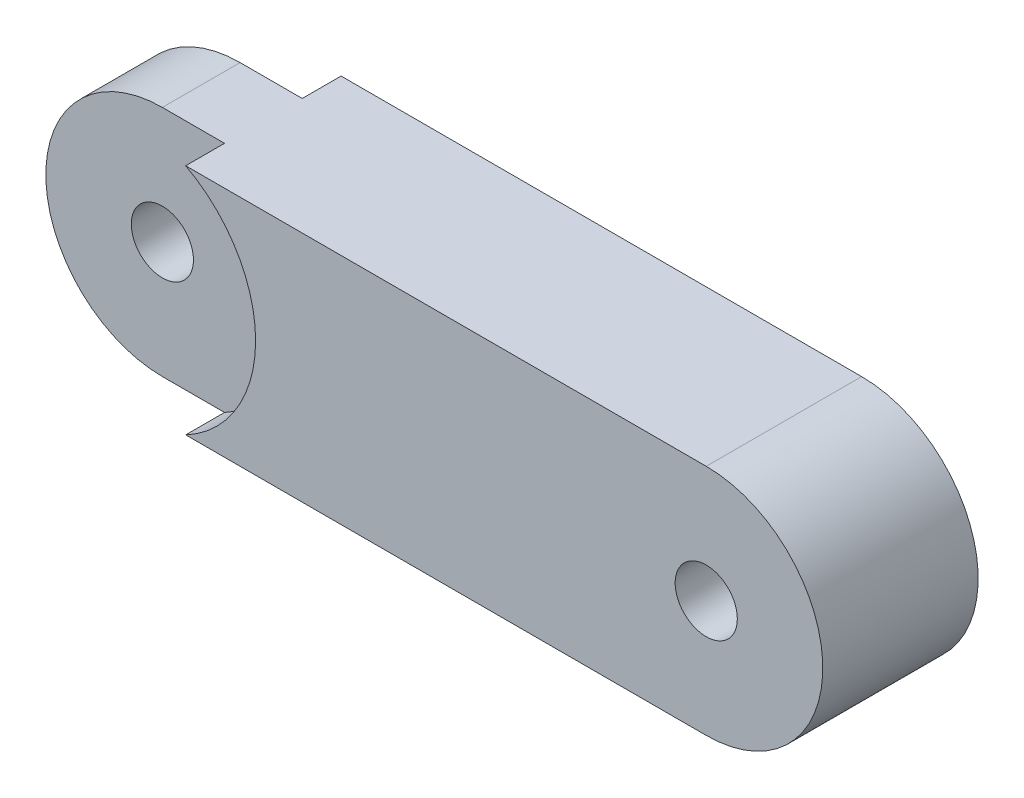
ISO-10303-21;
HEADER;
FILE_DESCRIPTION(('STEP AP214'),'2;1');
FILE_NAME('part.step','',(''),(''),'','','');
FILE_SCHEMA(('AUTOMOTIVE_DESIGN { 1 0 10303 214 1 1 1 1 }'));
ENDSEC;
DATA;
#1=APPLICATION_CONTEXT('core data for automotive mechanical design processes');
#2=APPLICATION_PROTOCOL_DEFINITION('international standard','automotive_design',2000,#1);
#3=PRODUCT_CONTEXT('',#1,'mechanical');
#4=PRODUCT('Part','Part','',(#3));
#5=PRODUCT_RELATED_PRODUCT_CATEGORY('part','',(#4));
#6=PRODUCT_DEFINITION_FORMATION('','',#4);
#7=PRODUCT_DEFINITION_CONTEXT('part definition',#1,'design');
#8=PRODUCT_DEFINITION('design','',#6,#7);
#9=PRODUCT_DEFINITION_SHAPE('','',#8);
#10=(LENGTH_UNIT() NAMED_UNIT(*) SI_UNIT(.MILLI.,.METRE.));
#11=(NAMED_UNIT(*) PLANE_ANGLE_UNIT() SI_UNIT($,.RADIAN.));
#12=(NAMED_UNIT(*) SI_UNIT($,.STERADIAN.) SOLID_ANGLE_UNIT());
#13=UNCERTAINTY_MEASURE_WITH_UNIT(LENGTH_MEASURE(1.E-05),#10,'distance_accuracy_value','');
#14=(GEOMETRIC_REPRESENTATION_CONTEXT(3) GLOBAL_UNCERTAINTY_ASSIGNED_CONTEXT((#13)) GLOBAL_UNIT_ASSIGNED_CONTEXT((#10,
#11,#12)) REPRESENTATION_CONTEXT('',''));
#15=CARTESIAN_POINT('',(0.,0.,0.));
#16=DIRECTION('',(0.,0.,1.));
#17=DIRECTION('',(1.,0.,0.));
#18=AXIS2_PLACEMENT_3D('',#15,#16,#17);
#19=CARTESIAN_POINT('',(0.,-15.,20.));
#20=DIRECTION('',(0.,1.,0.));
#21=DIRECTION('',(0.,0.,1.));
#22=AXIS2_PLACEMENT_3D('',#19,#20,#21);
#23=PLANE('',#22);
#24=DIRECTION('',(0.,0.,-1.));
#25=VECTOR('',#24,1.);
#26=CARTESIAN_POINT('',(8.,-15.,20.));
#27=LINE('',#26,#25);
#28=CARTESIAN_POINT('',(8.,-15.,15.));
#29=VERTEX_POINT('',#28);
#30=CARTESIAN_POINT('',(8.,-15.,20.));
#31=VERTEX_POINT('',#30);
#32=EDGE_CURVE('E122',#29,#31,#27,.F.);
#33=ORIENTED_EDGE('',*,*,#32,.F.);
#34=DIRECTION('',(1.,0.,0.));
#35=VECTOR('',#34,1.);
#36=CARTESIAN_POINT('',(0.,-15.,15.));
#37=LINE('',#36,#35);
#38=CARTESIAN_POINT('',(0.,-15.,15.));
#39=VERTEX_POINT('',#38);
#40=EDGE_CURVE('E123',#39,#29,#37,.T.);
#41=ORIENTED_EDGE('',*,*,#40,.F.);
#42=DIRECTION('',(0.,0.,-1.));
#43=VECTOR('',#42,1.);
#44=CARTESIAN_POINT('',(0.,-15.,20.));
#45=LINE('',#44,#43);
#46=CARTESIAN_POINT('',(0.,-15.,5.));
#47=VERTEX_POINT('',#46);
#48=EDGE_CURVE('E54',#39,#47,#45,.T.);
#49=ORIENTED_EDGE('',*,*,#48,.T.);
#50=DIRECTION('',(1.,0.,0.));
#51=VECTOR('',#50,1.);
#52=CARTESIAN_POINT('',(0.,-15.,5.));
#53=LINE('',#52,#51);
#54=CARTESIAN_POINT('',(8.,-15.,5.));
#55=VERTEX_POINT('',#54);
#56=EDGE_CURVE('E156',#47,#55,#53,.T.);
#57=ORIENTED_EDGE('',*,*,#56,.T.);
#58=DIRECTION('',(0.,0.,-1.));
#59=VECTOR('',#58,1.);
#60=CARTESIAN_POINT('',(8.,-15.,5.));
#61=LINE('',#60,#59);
#62=CARTESIAN_POINT('',(8.,-15.,0.));
#63=VERTEX_POINT('',#62);
#64=EDGE_CURVE('E160',#63,#55,#61,.F.);
#65=ORIENTED_EDGE('',*,*,#64,.F.);
#66=DIRECTION('',(1.,0.,0.));
#67=VECTOR('',#66,1.);
#68=CARTESIAN_POINT('',(0.,-15.,0.));
#69=LINE('',#68,#67);
#70=CARTESIAN_POINT('',(75.,-15.,0.));
#71=VERTEX_POINT('',#70);
#72=EDGE_CURVE('E168',#63,#71,#69,.T.);
#73=ORIENTED_EDGE('',*,*,#72,.T.);
#74=DIRECTION('',(0.,0.,-1.));
#75=VECTOR('',#74,1.);
#76=CARTESIAN_POINT('',(75.,-15.,20.));
#77=LINE('',#76,#75);
#78=CARTESIAN_POINT('',(75.,-15.,20.));
#79=VERTEX_POINT('',#78);
#80=EDGE_CURVE('E196',#79,#71,#77,.T.);
#81=ORIENTED_EDGE('',*,*,#80,.F.);
#82=DIRECTION('',(1.,0.,0.));
#83=VECTOR('',#82,1.);
#84=CARTESIAN_POINT('',(0.,-15.,20.));
#85=LINE('',#84,#83);
#86=EDGE_CURVE('E172',#31,#79,#85,.T.);
#87=ORIENTED_EDGE('',*,*,#86,.F.);
#88=EDGE_LOOP('',(#33,#41,#49,#57,#65,#73,#81,#87));
#89=FACE_BOUND('',#88,.T.);
#90=ADVANCED_FACE('F44',(#89),#23,.F.);
#91=CARTESIAN_POINT('',(0.,15.,20.));
#92=DIRECTION('',(0.,-1.,0.));
#93=DIRECTION('',(0.,0.,-1.));
#94=AXIS2_PLACEMENT_3D('',#91,#92,#93);
#95=PLANE('',#94);
#96=DIRECTION('',(0.,0.,-1.));
#97=VECTOR('',#96,1.);
#98=CARTESIAN_POINT('',(8.,15.,20.));
#99=LINE('',#98,#97);
#100=CARTESIAN_POINT('',(8.,15.,20.));
#101=VERTEX_POINT('',#100);
#102=CARTESIAN_POINT('',(8.,15.,15.));
#103=VERTEX_POINT('',#102);
#104=EDGE_CURVE('E112',#101,#103,#99,.T.);
#105=ORIENTED_EDGE('',*,*,#104,.F.);
#106=DIRECTION('',(-1.,0.,0.));
#107=VECTOR('',#106,1.);
#108=CARTESIAN_POINT('',(0.,15.,20.));
#109=LINE('',#108,#107);
#110=CARTESIAN_POINT('',(75.,15.,20.));
#111=VERTEX_POINT('',#110);
#112=EDGE_CURVE('E179',#111,#101,#109,.T.);
#113=ORIENTED_EDGE('',*,*,#112,.F.);
#114=DIRECTION('',(0.,0.,-1.));
#115=VECTOR('',#114,1.);
#116=CARTESIAN_POINT('',(75.,15.,20.));
#117=LINE('',#116,#115);
#118=CARTESIAN_POINT('',(75.,15.,0.));
#119=VERTEX_POINT('',#118);
#120=EDGE_CURVE('E192',#111,#119,#117,.T.);
#121=ORIENTED_EDGE('',*,*,#120,.T.);
#122=DIRECTION('',(-1.,0.,0.));
#123=VECTOR('',#122,1.);
#124=CARTESIAN_POINT('',(0.,15.,0.));
#125=LINE('',#124,#123);
#126=CARTESIAN_POINT('',(8.,15.,0.));
#127=VERTEX_POINT('',#126);
#128=EDGE_CURVE('E176',#119,#127,#125,.T.);
#129=ORIENTED_EDGE('',*,*,#128,.T.);
#130=DIRECTION('',(0.,0.,-1.));
#131=VECTOR('',#130,1.);
#132=CARTESIAN_POINT('',(8.,15.,5.));
#133=LINE('',#132,#131);
#134=CARTESIAN_POINT('',(8.,15.,5.));
#135=VERTEX_POINT('',#134);
#136=EDGE_CURVE('E11',#135,#127,#133,.T.);
#137=ORIENTED_EDGE('',*,*,#136,.F.);
#138=DIRECTION('',(-1.,0.,0.));
#139=VECTOR('',#138,1.);
#140=CARTESIAN_POINT('',(0.,15.,5.));
#141=LINE('',#140,#139);
#142=CARTESIAN_POINT('',(0.,15.,5.));
#143=VERTEX_POINT('',#142);
#144=EDGE_CURVE('E150',#135,#143,#141,.T.);
#145=ORIENTED_EDGE('',*,*,#144,.T.);
#146=DIRECTION('',(0.,0.,-1.));
#147=VECTOR('',#146,1.);
#148=CARTESIAN_POINT('',(0.,15.,20.));
#149=LINE('',#148,#147);
#150=CARTESIAN_POINT('',(0.,15.,15.));
#151=VERTEX_POINT('',#150);
#152=EDGE_CURVE('E68',#151,#143,#149,.T.);
#153=ORIENTED_EDGE('',*,*,#152,.F.);
#154=DIRECTION('',(-1.,0.,0.));
#155=VECTOR('',#154,1.);
#156=CARTESIAN_POINT('',(0.,15.,15.));
#157=LINE('',#156,#155);
#158=EDGE_CURVE('E61',#103,#151,#157,.T.);
#159=ORIENTED_EDGE('',*,*,#158,.F.);
#160=EDGE_LOOP('',(#105,#113,#121,#129,#137,#145,#153,#159));
#161=FACE_BOUND('',#160,.T.);
#162=ADVANCED_FACE('F129',(#161),#95,.F.);
#163=CARTESIAN_POINT('',(0.,0.,20.));
#164=DIRECTION('',(0.,0.,-1.));
#165=DIRECTION('',(-1.,0.,0.));
#166=AXIS2_PLACEMENT_3D('',#163,#164,#165);
#167=CYLINDRICAL_SURFACE('',#166,15.);
#168=CARTESIAN_POINT('',(0.,0.,15.));
#169=DIRECTION('',(0.,0.,1.));
#170=DIRECTION('',(1.,0.,0.));
#171=AXIS2_PLACEMENT_3D('',#168,#169,#170);
#172=CIRCLE('',#171,15.);
#173=EDGE_CURVE('E132',#151,#39,#172,.T.);
#174=ORIENTED_EDGE('',*,*,#173,.F.);
#175=ORIENTED_EDGE('',*,*,#152,.T.);
#176=CARTESIAN_POINT('',(0.,0.,5.));
#177=DIRECTION('',(0.,0.,1.));
#178=DIRECTION('',(1.,0.,0.));
#179=AXIS2_PLACEMENT_3D('',#176,#177,#178);
#180=CIRCLE('',#179,15.);
#181=EDGE_CURVE('E153',#143,#47,#180,.T.);
#182=ORIENTED_EDGE('',*,*,#181,.T.);
#183=ORIENTED_EDGE('',*,*,#48,.F.);
#184=EDGE_LOOP('',(#174,#175,#182,#183));
#185=FACE_BOUND('',#184,.T.);
#186=ADVANCED_FACE('F46',(#185),#167,.T.);
#187=CARTESIAN_POINT('',(0.,0.,20.));
#188=DIRECTION('',(0.,0.,-1.));
#189=DIRECTION('',(-1.,0.,0.));
#190=AXIS2_PLACEMENT_3D('',#187,#188,#189);
#191=CYLINDRICAL_SURFACE('',#190,4.);
#192=CARTESIAN_POINT('',(0.,0.,5.));
#193=DIRECTION('',(0.,0.,1.));
#194=DIRECTION('',(1.,0.,0.));
#195=AXIS2_PLACEMENT_3D('',#192,#193,#194);
#196=CIRCLE('',#195,4.);
#197=CARTESIAN_POINT('',(4.,0.,5.));
#198=VERTEX_POINT('',#197);
#199=EDGE_CURVE('E146',#198,#198,#196,.T.);
#200=ORIENTED_EDGE('',*,*,#199,.F.);
#201=EDGE_LOOP('',(#200));
#202=FACE_BOUND('',#201,.T.);
#203=CARTESIAN_POINT('',(0.,0.,15.));
#204=DIRECTION('',(0.,0.,1.));
#205=DIRECTION('',(1.,0.,0.));
#206=AXIS2_PLACEMENT_3D('',#203,#204,#205);
#207=CIRCLE('',#206,4.);
#208=CARTESIAN_POINT('',(4.,0.,15.));
#209=VERTEX_POINT('',#208);
#210=EDGE_CURVE('E48',#209,#209,#207,.T.);
#211=ORIENTED_EDGE('',*,*,#210,.T.);
#212=EDGE_LOOP('',(#211));
#213=FACE_BOUND('',#212,.T.);
#214=ADVANCED_FACE('F209',(#202,#213),#191,.F.);
#215=CARTESIAN_POINT('',(0.,0.,20.));
#216=DIRECTION('',(0.,0.,1.));
#217=DIRECTION('',(1.,0.,0.));
#218=AXIS2_PLACEMENT_3D('',#215,#216,#217);
#219=PLANE('',#218);
#220=ORIENTED_EDGE('',*,*,#112,.T.);
#221=CARTESIAN_POINT('',(0.,0.,20.));
#222=DIRECTION('',(0.,0.,1.));
#223=DIRECTION('',(1.,0.,0.));
#224=AXIS2_PLACEMENT_3D('',#221,#222,#223);
#225=CIRCLE('',#224,17.);
#226=EDGE_CURVE('E117',#31,#101,#225,.T.);
#227=ORIENTED_EDGE('',*,*,#226,.F.);
#228=ORIENTED_EDGE('',*,*,#86,.T.);
#229=CARTESIAN_POINT('',(75.,0.,20.));
#230=DIRECTION('',(0.,0.,1.));
#231=DIRECTION('',(1.,0.,0.));
#232=AXIS2_PLACEMENT_3D('',#229,#230,#231);
#233=CIRCLE('',#232,15.);
#234=EDGE_CURVE('E175',#79,#111,#233,.T.);
#235=ORIENTED_EDGE('',*,*,#234,.T.);
#236=EDGE_LOOP('',(#220,#227,#228,#235));
#237=FACE_BOUND('',#236,.T.);
#238=CARTESIAN_POINT('',(75.,0.,20.));
#239=DIRECTION('',(0.,0.,1.));
#240=DIRECTION('',(1.,0.,0.));
#241=AXIS2_PLACEMENT_3D('',#238,#239,#240);
#242=CIRCLE('',#241,4.00000000000001);
#243=CARTESIAN_POINT('',(79.,0.,20.));
#244=VERTEX_POINT('',#243);
#245=EDGE_CURVE('E164',#244,#244,#242,.T.);
#246=ORIENTED_EDGE('',*,*,#245,.F.);
#247=EDGE_LOOP('',(#246));
#248=FACE_BOUND('',#247,.T.);
#249=ADVANCED_FACE('F212',(#237,#248),#219,.T.);
#250=CARTESIAN_POINT('',(0.,0.,0.));
#251=DIRECTION('',(0.,0.,1.));
#252=DIRECTION('',(1.,0.,0.));
#253=AXIS2_PLACEMENT_3D('',#250,#251,#252);
#254=PLANE('',#253);
#255=CARTESIAN_POINT('',(0.,0.,0.));
#256=DIRECTION('',(0.,0.,1.));
#257=DIRECTION('',(1.,0.,0.));
#258=AXIS2_PLACEMENT_3D('',#255,#256,#257);
#259=CIRCLE('',#258,17.);
#260=EDGE_CURVE('E141',#63,#127,#259,.T.);
#261=ORIENTED_EDGE('',*,*,#260,.T.);
#262=ORIENTED_EDGE('',*,*,#128,.F.);
#263=CARTESIAN_POINT('',(75.,0.,0.));
#264=DIRECTION('',(0.,0.,1.));
#265=DIRECTION('',(1.,0.,0.));
#266=AXIS2_PLACEMENT_3D('',#263,#264,#265);
#267=CIRCLE('',#266,15.);
#268=EDGE_CURVE('E184',#71,#119,#267,.T.);
#269=ORIENTED_EDGE('',*,*,#268,.F.);
#270=ORIENTED_EDGE('',*,*,#72,.F.);
#271=EDGE_LOOP('',(#261,#262,#269,#270));
#272=FACE_BOUND('',#271,.T.);
#273=CARTESIAN_POINT('',(75.,0.,0.));
#274=DIRECTION('',(0.,0.,1.));
#275=DIRECTION('',(1.,0.,0.));
#276=AXIS2_PLACEMENT_3D('',#273,#274,#275);
#277=CIRCLE('',#276,4.00000000000001);
#278=CARTESIAN_POINT('',(79.,0.,0.));
#279=VERTEX_POINT('',#278);
#280=EDGE_CURVE('E163',#279,#279,#277,.T.);
#281=ORIENTED_EDGE('',*,*,#280,.T.);
#282=EDGE_LOOP('',(#281));
#283=FACE_BOUND('',#282,.T.);
#284=ADVANCED_FACE('F237',(#272,#283),#254,.F.);
#285=CARTESIAN_POINT('',(75.,0.,20.));
#286=DIRECTION('',(0.,0.,-1.));
#287=DIRECTION('',(-1.,0.,0.));
#288=AXIS2_PLACEMENT_3D('',#285,#286,#287);
#289=CYLINDRICAL_SURFACE('',#288,15.);
#290=ORIENTED_EDGE('',*,*,#268,.T.);
#291=ORIENTED_EDGE('',*,*,#120,.F.);
#292=ORIENTED_EDGE('',*,*,#234,.F.);
#293=ORIENTED_EDGE('',*,*,#80,.T.);
#294=EDGE_LOOP('',(#290,#291,#292,#293));
#295=FACE_BOUND('',#294,.T.);
#296=ADVANCED_FACE('F234',(#295),#289,.T.);
#297=CARTESIAN_POINT('',(75.,0.,20.));
#298=DIRECTION('',(0.,0.,-1.));
#299=DIRECTION('',(-1.,0.,0.));
#300=AXIS2_PLACEMENT_3D('',#297,#298,#299);
#301=CYLINDRICAL_SURFACE('',#300,4.00000000000001);
#302=ORIENTED_EDGE('',*,*,#245,.T.);
#303=EDGE_LOOP('',(#302));
#304=FACE_BOUND('',#303,.T.);
#305=ORIENTED_EDGE('',*,*,#280,.F.);
#306=EDGE_LOOP('',(#305));
#307=FACE_BOUND('',#306,.T.);
#308=ADVANCED_FACE('F236',(#304,#307),#301,.F.);
#309=CARTESIAN_POINT('',(0.,0.,5.));
#310=DIRECTION('',(0.,0.,-1.));
#311=DIRECTION('',(-1.,0.,0.));
#312=AXIS2_PLACEMENT_3D('',#309,#310,#311);
#313=CYLINDRICAL_SURFACE('',#312,17.);
#314=ORIENTED_EDGE('',*,*,#64,.T.);
#315=CARTESIAN_POINT('',(0.,0.,5.));
#316=DIRECTION('',(0.,0.,1.));
#317=DIRECTION('',(1.,0.,0.));
#318=AXIS2_PLACEMENT_3D('',#315,#316,#317);
#319=CIRCLE('',#318,17.);
#320=EDGE_CURVE('E142',#55,#135,#319,.T.);
#321=ORIENTED_EDGE('',*,*,#320,.T.);
#322=ORIENTED_EDGE('',*,*,#136,.T.);
#323=ORIENTED_EDGE('',*,*,#260,.F.);
#324=EDGE_LOOP('',(#314,#321,#322,#323));
#325=FACE_BOUND('',#324,.T.);
#326=ADVANCED_FACE('F248',(#325),#313,.F.);
#327=CARTESIAN_POINT('',(0.,0.,5.));
#328=DIRECTION('',(0.,0.,1.));
#329=DIRECTION('',(1.,0.,0.));
#330=AXIS2_PLACEMENT_3D('',#327,#328,#329);
#331=PLANE('',#330);
#332=ORIENTED_EDGE('',*,*,#199,.T.);
#333=EDGE_LOOP('',(#332));
#334=FACE_BOUND('',#333,.T.);
#335=ORIENTED_EDGE('',*,*,#181,.F.);
#336=ORIENTED_EDGE('',*,*,#144,.F.);
#337=ORIENTED_EDGE('',*,*,#320,.F.);
#338=ORIENTED_EDGE('',*,*,#56,.F.);
#339=EDGE_LOOP('',(#335,#336,#337,#338));
#340=FACE_BOUND('',#339,.T.);
#341=ADVANCED_FACE('F206',(#334,#340),#331,.F.);
#342=CARTESIAN_POINT('',(0.,0.,20.));
#343=DIRECTION('',(0.,0.,-1.));
#344=DIRECTION('',(-1.,0.,0.));
#345=AXIS2_PLACEMENT_3D('',#342,#343,#344);
#346=CYLINDRICAL_SURFACE('',#345,17.);
#347=ORIENTED_EDGE('',*,*,#32,.T.);
#348=ORIENTED_EDGE('',*,*,#226,.T.);
#349=ORIENTED_EDGE('',*,*,#104,.T.);
#350=CARTESIAN_POINT('',(0.,0.,15.));
#351=DIRECTION('',(0.,0.,1.));
#352=DIRECTION('',(1.,0.,0.));
#353=AXIS2_PLACEMENT_3D('',#350,#351,#352);
#354=CIRCLE('',#353,17.);
#355=EDGE_CURVE('E114',#29,#103,#354,.T.);
#356=ORIENTED_EDGE('',*,*,#355,.F.);
#357=EDGE_LOOP('',(#347,#348,#349,#356));
#358=FACE_BOUND('',#357,.T.);
#359=ADVANCED_FACE('F113',(#358),#346,.F.);
#360=CARTESIAN_POINT('',(0.,0.,15.));
#361=DIRECTION('',(0.,0.,1.));
#362=DIRECTION('',(1.,0.,0.));
#363=AXIS2_PLACEMENT_3D('',#360,#361,#362);
#364=PLANE('',#363);
#365=ORIENTED_EDGE('',*,*,#210,.F.);
#366=EDGE_LOOP('',(#365));
#367=FACE_BOUND('',#366,.T.);
#368=ORIENTED_EDGE('',*,*,#40,.T.);
#369=ORIENTED_EDGE('',*,*,#355,.T.);
#370=ORIENTED_EDGE('',*,*,#158,.T.);
#371=ORIENTED_EDGE('',*,*,#173,.T.);
#372=EDGE_LOOP('',(#368,#369,#370,#371));
#373=FACE_BOUND('',#372,.T.);
#374=ADVANCED_FACE('F125',(#367,#373),#364,.T.);
#375=CLOSED_SHELL('',(#90,#162,#186,#214,#249,#284,#296,#308,#326,#341,#359,#374));
#376=MANIFOLD_SOLID_BREP('B2',#375);
#377=ADVANCED_BREP_SHAPE_REPRESENTATION('',(#18,#376),#14);
#378=SHAPE_DEFINITION_REPRESENTATION(#9,#377);
ENDSEC;
END-ISO-10303-21;
